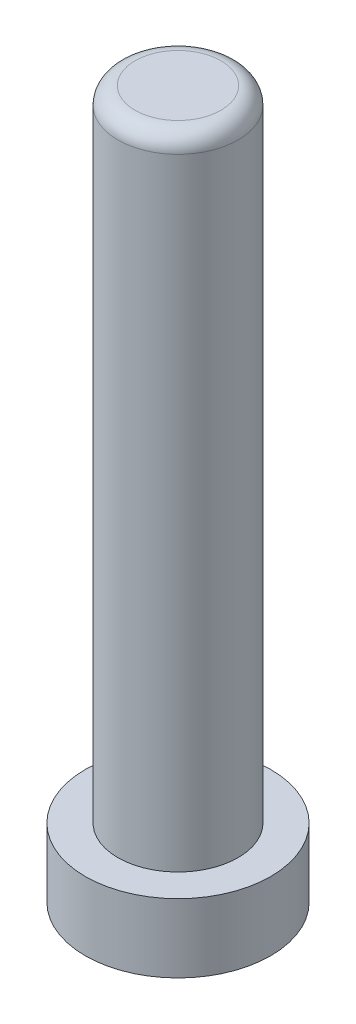
ISO-10303-21;
HEADER;
FILE_DESCRIPTION(('STEP AP214'),'2;1');
FILE_NAME('part.step','',(''),(''),'','','');
FILE_SCHEMA(('AUTOMOTIVE_DESIGN { 1 0 10303 214 1 1 1 1 }'));
ENDSEC;
DATA;
#1=APPLICATION_CONTEXT('core data for automotive mechanical design processes');
#2=APPLICATION_PROTOCOL_DEFINITION('international standard','automotive_design',2000,#1);
#3=PRODUCT_CONTEXT('',#1,'mechanical');
#4=PRODUCT('Part','Part','',(#3));
#5=PRODUCT_RELATED_PRODUCT_CATEGORY('part','',(#4));
#6=PRODUCT_DEFINITION_FORMATION('','',#4);
#7=PRODUCT_DEFINITION_CONTEXT('part definition',#1,'design');
#8=PRODUCT_DEFINITION('design','',#6,#7);
#9=PRODUCT_DEFINITION_SHAPE('','',#8);
#10=(LENGTH_UNIT() NAMED_UNIT(*) SI_UNIT(.MILLI.,.METRE.));
#11=(NAMED_UNIT(*) PLANE_ANGLE_UNIT() SI_UNIT($,.RADIAN.));
#12=(NAMED_UNIT(*) SI_UNIT($,.STERADIAN.) SOLID_ANGLE_UNIT());
#13=UNCERTAINTY_MEASURE_WITH_UNIT(LENGTH_MEASURE(1.E-05),#10,'distance_accuracy_value','');
#14=(GEOMETRIC_REPRESENTATION_CONTEXT(3) GLOBAL_UNCERTAINTY_ASSIGNED_CONTEXT((#13)) GLOBAL_UNIT_ASSIGNED_CONTEXT((#10,
#11,#12)) REPRESENTATION_CONTEXT('',''));
#15=CARTESIAN_POINT('',(0.,0.,0.));
#16=DIRECTION('',(0.,0.,1.));
#17=DIRECTION('',(1.,0.,0.));
#18=AXIS2_PLACEMENT_3D('',#15,#16,#17);
#19=CARTESIAN_POINT('',(0.,2.,0.));
#20=DIRECTION('',(0.,-1.,0.));
#21=DIRECTION('',(0.,0.,-1.));
#22=AXIS2_PLACEMENT_3D('',#19,#20,#21);
#23=CYLINDRICAL_SURFACE('',#22,2.7);
#24=CARTESIAN_POINT('',(0.,2.,0.));
#25=DIRECTION('',(0.,1.,0.));
#26=DIRECTION('',(0.,0.,1.));
#27=AXIS2_PLACEMENT_3D('',#24,#25,#26);
#28=CIRCLE('',#27,2.7);
#29=CARTESIAN_POINT('',(0.,2.,2.7));
#30=VERTEX_POINT('',#29);
#31=EDGE_CURVE('E51',#30,#30,#28,.T.);
#32=ORIENTED_EDGE('',*,*,#31,.F.);
#33=EDGE_LOOP('',(#32));
#34=FACE_BOUND('',#33,.T.);
#35=CARTESIAN_POINT('',(0.,0.,0.));
#36=DIRECTION('',(0.,1.,0.));
#37=DIRECTION('',(0.,0.,1.));
#38=AXIS2_PLACEMENT_3D('',#35,#36,#37);
#39=CIRCLE('',#38,2.7);
#40=CARTESIAN_POINT('',(0.,0.,2.7));
#41=VERTEX_POINT('',#40);
#42=EDGE_CURVE('E54',#41,#41,#39,.T.);
#43=ORIENTED_EDGE('',*,*,#42,.T.);
#44=EDGE_LOOP('',(#43));
#45=FACE_BOUND('',#44,.T.);
#46=ADVANCED_FACE('F37',(#34,#45),#23,.T.);
#47=CARTESIAN_POINT('',(0.,2.,0.));
#48=DIRECTION('',(0.,1.,0.));
#49=DIRECTION('',(0.,0.,1.));
#50=AXIS2_PLACEMENT_3D('',#47,#48,#49);
#51=PLANE('',#50);
#52=CARTESIAN_POINT('',(0.,2.,0.));
#53=DIRECTION('',(0.,1.,0.));
#54=DIRECTION('',(0.,0.,1.));
#55=AXIS2_PLACEMENT_3D('',#52,#53,#54);
#56=CIRCLE('',#55,1.75);
#57=CARTESIAN_POINT('',(0.,2.,1.75));
#58=VERTEX_POINT('',#57);
#59=EDGE_CURVE('E58',#58,#58,#56,.T.);
#60=ORIENTED_EDGE('',*,*,#59,.F.);
#61=EDGE_LOOP('',(#60));
#62=FACE_BOUND('',#61,.T.);
#63=ORIENTED_EDGE('',*,*,#31,.T.);
#64=EDGE_LOOP('',(#63));
#65=FACE_BOUND('',#64,.T.);
#66=ADVANCED_FACE('F102',(#62,#65),#51,.T.);
#67=CARTESIAN_POINT('',(0.,0.,0.));
#68=DIRECTION('',(0.,1.,0.));
#69=DIRECTION('',(0.,0.,1.));
#70=AXIS2_PLACEMENT_3D('',#67,#68,#69);
#71=PLANE('',#70);
#72=CARTESIAN_POINT('',(0.,0.,0.));
#73=DIRECTION('',(0.,-1.,0.));
#74=DIRECTION('',(0.,0.,-1.));
#75=AXIS2_PLACEMENT_3D('',#72,#73,#74);
#76=CIRCLE('',#75,1.2);
#77=CARTESIAN_POINT('',(0.,0.,-1.2));
#78=VERTEX_POINT('',#77);
#79=EDGE_CURVE('E66',#78,#78,#76,.T.);
#80=ORIENTED_EDGE('',*,*,#79,.F.);
#81=EDGE_LOOP('',(#80));
#82=FACE_BOUND('',#81,.T.);
#83=ORIENTED_EDGE('',*,*,#42,.F.);
#84=EDGE_LOOP('',(#83));
#85=FACE_BOUND('',#84,.T.);
#86=ADVANCED_FACE('F98',(#82,#85),#71,.F.);
#87=CARTESIAN_POINT('',(0.,20.6,0.));
#88=DIRECTION('',(0.,-1.,0.));
#89=DIRECTION('',(0.,0.,-1.));
#90=AXIS2_PLACEMENT_3D('',#87,#88,#89);
#91=CYLINDRICAL_SURFACE('',#90,1.75);
#92=CARTESIAN_POINT('',(0.,20.1,0.));
#93=DIRECTION('',(0.,1.,0.));
#94=DIRECTION('',(0.,0.,1.));
#95=AXIS2_PLACEMENT_3D('',#92,#93,#94);
#96=CIRCLE('',#95,1.75);
#97=CARTESIAN_POINT('',(0.,20.1,1.75));
#98=VERTEX_POINT('',#97);
#99=EDGE_CURVE('E10',#98,#98,#96,.F.);
#100=ORIENTED_EDGE('',*,*,#99,.T.);
#101=EDGE_LOOP('',(#100));
#102=FACE_BOUND('',#101,.T.);
#103=ORIENTED_EDGE('',*,*,#59,.T.);
#104=EDGE_LOOP('',(#103));
#105=FACE_BOUND('',#104,.T.);
#106=ADVANCED_FACE('F101',(#102,#105),#91,.T.);
#107=CARTESIAN_POINT('',(0.,20.6,0.));
#108=DIRECTION('',(0.,1.,0.));
#109=DIRECTION('',(0.,0.,1.));
#110=AXIS2_PLACEMENT_3D('',#107,#108,#109);
#111=PLANE('',#110);
#112=CARTESIAN_POINT('',(0.,20.6,0.));
#113=DIRECTION('',(0.,1.,0.));
#114=DIRECTION('',(0.,0.,1.));
#115=AXIS2_PLACEMENT_3D('',#112,#113,#114);
#116=CIRCLE('',#115,1.25);
#117=CARTESIAN_POINT('',(0.,20.6,1.25));
#118=VERTEX_POINT('',#117);
#119=EDGE_CURVE('E46',#118,#118,#116,.T.);
#120=ORIENTED_EDGE('',*,*,#119,.T.);
#121=EDGE_LOOP('',(#120));
#122=FACE_BOUND('',#121,.T.);
#123=ADVANCED_FACE('F94',(#122),#111,.T.);
#124=CARTESIAN_POINT('',(0.,2.8,0.));
#125=DIRECTION('',(0.,-1.,0.));
#126=DIRECTION('',(0.,0.,-1.));
#127=AXIS2_PLACEMENT_3D('',#124,#125,#126);
#128=CYLINDRICAL_SURFACE('',#127,1.2);
#129=CARTESIAN_POINT('',(0.,2.8,0.));
#130=DIRECTION('',(0.,-1.,0.));
#131=DIRECTION('',(0.,0.,-1.));
#132=AXIS2_PLACEMENT_3D('',#129,#130,#131);
#133=CIRCLE('',#132,1.2);
#134=CARTESIAN_POINT('',(0.,2.8,-1.2));
#135=VERTEX_POINT('',#134);
#136=EDGE_CURVE('E65',#135,#135,#133,.T.);
#137=ORIENTED_EDGE('',*,*,#136,.F.);
#138=EDGE_LOOP('',(#137));
#139=FACE_BOUND('',#138,.T.);
#140=ORIENTED_EDGE('',*,*,#79,.T.);
#141=EDGE_LOOP('',(#140));
#142=FACE_BOUND('',#141,.T.);
#143=ADVANCED_FACE('F88',(#139,#142),#128,.F.);
#144=CARTESIAN_POINT('',(0.,2.8,0.));
#145=DIRECTION('',(0.,-1.,0.));
#146=DIRECTION('',(0.,0.,-1.));
#147=AXIS2_PLACEMENT_3D('',#144,#145,#146);
#148=PLANE('',#147);
#149=CARTESIAN_POINT('',(0.,2.8,0.));
#150=DIRECTION('',(0.,-1.,0.));
#151=DIRECTION('',(0.,0.,-1.));
#152=AXIS2_PLACEMENT_3D('',#149,#150,#151);
#153=CIRCLE('',#152,0.85);
#154=CARTESIAN_POINT('',(0.,2.8,-0.85));
#155=VERTEX_POINT('',#154);
#156=EDGE_CURVE('E41',#155,#155,#153,.T.);
#157=ORIENTED_EDGE('',*,*,#156,.F.);
#158=EDGE_LOOP('',(#157));
#159=FACE_BOUND('',#158,.T.);
#160=ORIENTED_EDGE('',*,*,#136,.T.);
#161=EDGE_LOOP('',(#160));
#162=FACE_BOUND('',#161,.T.);
#163=ADVANCED_FACE('F85',(#159,#162),#148,.T.);
#164=CARTESIAN_POINT('',(0.,20.1,0.));
#165=DIRECTION('',(0.,1.,0.));
#166=DIRECTION('',(0.,0.,1.));
#167=AXIS2_PLACEMENT_3D('',#164,#165,#166);
#168=TOROIDAL_SURFACE('',#167,1.25,0.5);
#169=ORIENTED_EDGE('',*,*,#99,.F.);
#170=EDGE_LOOP('',(#169));
#171=FACE_BOUND('',#170,.T.);
#172=ORIENTED_EDGE('',*,*,#119,.F.);
#173=EDGE_LOOP('',(#172));
#174=FACE_BOUND('',#173,.T.);
#175=ADVANCED_FACE('F39',(#171,#174),#168,.T.);
#176=CARTESIAN_POINT('',(0.,10.5,0.));
#177=DIRECTION('',(0.,-1.,0.));
#178=DIRECTION('',(0.,0.,-1.));
#179=AXIS2_PLACEMENT_3D('',#176,#177,#178);
#180=CYLINDRICAL_SURFACE('',#179,0.85);
#181=CARTESIAN_POINT('',(0.,10.5,0.));
#182=DIRECTION('',(0.,-1.,0.));
#183=DIRECTION('',(0.,0.,-1.));
#184=AXIS2_PLACEMENT_3D('',#181,#182,#183);
#185=CIRCLE('',#184,0.85);
#186=CARTESIAN_POINT('',(0.,10.5,-0.85));
#187=VERTEX_POINT('',#186);
#188=EDGE_CURVE('E73',#187,#187,#185,.T.);
#189=CARTESIAN_POINT('',(0.,2.8,-0.85));
#190=CARTESIAN_POINT('',(0.,2.88020833333333,-0.85));
#191=CARTESIAN_POINT('',(0.,2.96041666666667,-0.85));
#192=CARTESIAN_POINT('',(0.,3.12083333333333,-0.85));
#193=CARTESIAN_POINT('',(0.,3.20104166666667,-0.85));
#194=CARTESIAN_POINT('',(0.,3.36145833333333,-0.85));
#195=CARTESIAN_POINT('',(0.,3.44166666666667,-0.85));
#196=CARTESIAN_POINT('',(0.,3.60208333333333,-0.85));
#197=CARTESIAN_POINT('',(0.,3.68229166666667,-0.85));
#198=CARTESIAN_POINT('',(0.,3.84270833333333,-0.85));
#199=CARTESIAN_POINT('',(0.,3.92291666666667,-0.85));
#200=CARTESIAN_POINT('',(0.,4.08333333333333,-0.85));
#201=CARTESIAN_POINT('',(0.,4.16354166666667,-0.85));
#202=CARTESIAN_POINT('',(0.,4.32395833333334,-0.85));
#203=CARTESIAN_POINT('',(0.,4.40416666666667,-0.85));
#204=CARTESIAN_POINT('',(0.,4.56458333333333,-0.85));
#205=CARTESIAN_POINT('',(0.,4.64479166666667,-0.85));
#206=CARTESIAN_POINT('',(0.,4.80520833333333,-0.85));
#207=CARTESIAN_POINT('',(0.,4.88541666666667,-0.85));
#208=CARTESIAN_POINT('',(0.,5.04583333333334,-0.85));
#209=CARTESIAN_POINT('',(0.,5.12604166666667,-0.85));
#210=CARTESIAN_POINT('',(0.,5.28645833333333,-0.85));
#211=CARTESIAN_POINT('',(0.,5.36666666666667,-0.85));
#212=CARTESIAN_POINT('',(0.,5.52708333333333,-0.85));
#213=CARTESIAN_POINT('',(0.,5.60729166666667,-0.85));
#214=CARTESIAN_POINT('',(0.,5.76770833333333,-0.85));
#215=CARTESIAN_POINT('',(0.,5.84791666666667,-0.85));
#216=CARTESIAN_POINT('',(0.,6.00833333333334,-0.85));
#217=CARTESIAN_POINT('',(0.,6.08854166666667,-0.85));
#218=CARTESIAN_POINT('',(0.,6.24895833333333,-0.85));
#219=CARTESIAN_POINT('',(0.,6.32916666666667,-0.85));
#220=CARTESIAN_POINT('',(0.,6.48958333333333,-0.85));
#221=CARTESIAN_POINT('',(0.,6.56979166666667,-0.85));
#222=CARTESIAN_POINT('',(0.,6.73020833333333,-0.85));
#223=CARTESIAN_POINT('',(0.,6.81041666666667,-0.85));
#224=CARTESIAN_POINT('',(0.,6.97083333333333,-0.85));
#225=CARTESIAN_POINT('',(0.,7.05104166666667,-0.85));
#226=CARTESIAN_POINT('',(0.,7.21145833333334,-0.85));
#227=CARTESIAN_POINT('',(0.,7.29166666666667,-0.85));
#228=CARTESIAN_POINT('',(0.,7.45208333333334,-0.85));
#229=CARTESIAN_POINT('',(0.,7.53229166666667,-0.85));
#230=CARTESIAN_POINT('',(0.,7.69270833333333,-0.85));
#231=CARTESIAN_POINT('',(0.,7.77291666666667,-0.85));
#232=CARTESIAN_POINT('',(0.,7.93333333333333,-0.85));
#233=CARTESIAN_POINT('',(0.,8.01354166666667,-0.85));
#234=CARTESIAN_POINT('',(0.,8.17395833333333,-0.85));
#235=CARTESIAN_POINT('',(0.,8.25416666666667,-0.85));
#236=CARTESIAN_POINT('',(0.,8.41458333333333,-0.85));
#237=CARTESIAN_POINT('',(0.,8.49479166666667,-0.85));
#238=CARTESIAN_POINT('',(0.,8.65520833333333,-0.85));
#239=CARTESIAN_POINT('',(0.,8.73541666666667,-0.85));
#240=CARTESIAN_POINT('',(0.,8.89583333333334,-0.85));
#241=CARTESIAN_POINT('',(0.,8.97604166666667,-0.85));
#242=CARTESIAN_POINT('',(0.,9.13645833333334,-0.85));
#243=CARTESIAN_POINT('',(0.,9.21666666666667,-0.85));
#244=CARTESIAN_POINT('',(0.,9.37708333333333,-0.85));
#245=CARTESIAN_POINT('',(0.,9.45729166666667,-0.85));
#246=CARTESIAN_POINT('',(0.,9.61770833333334,-0.85));
#247=CARTESIAN_POINT('',(0.,9.69791666666667,-0.85));
#248=CARTESIAN_POINT('',(0.,9.85833333333334,-0.85));
#249=CARTESIAN_POINT('',(0.,9.93854166666667,-0.85));
#250=CARTESIAN_POINT('',(0.,10.0989583333333,-0.85));
#251=CARTESIAN_POINT('',(0.,10.1791666666667,-0.85));
#252=CARTESIAN_POINT('',(0.,10.3395833333333,-0.85));
#253=CARTESIAN_POINT('',(0.,10.4197916666667,-0.85));
#254=CARTESIAN_POINT('',(0.,10.5,-0.85));
#255=B_SPLINE_CURVE_WITH_KNOTS('',3,(#189,#190,#191,#192,#193,#194,#195,#196,#197,#198,#199,
#200,#201,#202,#203,#204,#205,#206,#207,#208,#209,#210,#211,#212,#213,#214,#215,#216,#217,#218,
#219,#220,#221,#222,#223,#224,#225,#226,#227,#228,#229,#230,#231,#232,#233,#234,#235,#236,#237,
#238,#239,#240,#241,#242,#243,#244,#245,#246,#247,#248,#249,#250,#251,#252,#253,#254),
.UNSPECIFIED.,.F.,.F.,(4,2,2,2,2,2,2,2,2,2,2,2,2,2,2,2,2,2,2,2,2,2,2,2,2,2,2,2,2,2,2,2,4),(0.,
0.240625,0.48125,0.721875,0.9625,1.203125,1.44375,1.684375,1.925,2.165625,2.40625,2.646875,
2.8875,3.128125,3.36875,3.609375,3.85,4.090625,4.33125,4.571875,4.8125,5.053125,5.29375,
5.534375,5.775,6.015625,6.25625,6.496875,6.7375,6.978125,7.21875,7.459375,7.7),.UNSPECIFIED.);
#256=EDGE_CURVE('BSEAM82',#155,#187,#255,.T.);
#257=ORIENTED_EDGE('',*,*,#156,.T.);
#258=ORIENTED_EDGE('',*,*,#188,.F.);
#259=ORIENTED_EDGE('',*,*,#256,.T.);
#260=ORIENTED_EDGE('',*,*,#256,.F.);
#261=EDGE_LOOP('',(#257,#259,#258,#260));
#262=FACE_BOUND('',#261,.T.);
#263=ADVANCED_FACE('F82',(#262),#180,.F.);
#264=CARTESIAN_POINT('',(0.,10.5,0.));
#265=DIRECTION('',(0.,-1.,0.));
#266=DIRECTION('',(0.,0.,-1.));
#267=AXIS2_PLACEMENT_3D('',#264,#265,#266);
#268=PLANE('',#267);
#269=ORIENTED_EDGE('',*,*,#188,.T.);
#270=EDGE_LOOP('',(#269));
#271=FACE_BOUND('',#270,.T.);
#272=ADVANCED_FACE('F122',(#271),#268,.T.);
#273=CLOSED_SHELL('',(#46,#66,#86,#106,#123,#143,#163,#175,#263,#272));
#274=MANIFOLD_SOLID_BREP('B2',#273);
#275=ADVANCED_BREP_SHAPE_REPRESENTATION('',(#18,#274),#14);
#276=SHAPE_DEFINITION_REPRESENTATION(#9,#275);
ENDSEC;
END-ISO-10303-21;
